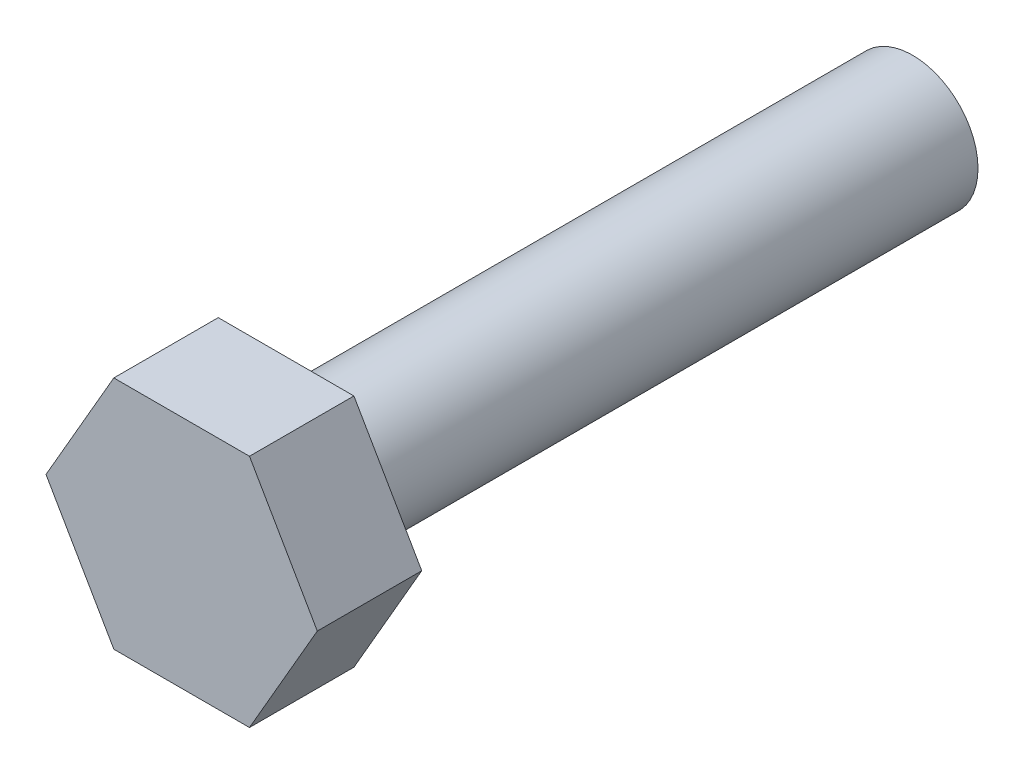
ISO-10303-21;
HEADER;
FILE_DESCRIPTION(('STEP AP214'),'2;1');
FILE_NAME('part.step','',(''),(''),'','','');
FILE_SCHEMA(('AUTOMOTIVE_DESIGN { 1 0 10303 214 1 1 1 1 }'));
ENDSEC;
DATA;
#1=APPLICATION_CONTEXT('core data for automotive mechanical design processes');
#2=APPLICATION_PROTOCOL_DEFINITION('international standard','automotive_design',2000,#1);
#3=PRODUCT_CONTEXT('',#1,'mechanical');
#4=PRODUCT('Part','Part','',(#3));
#5=PRODUCT_RELATED_PRODUCT_CATEGORY('part','',(#4));
#6=PRODUCT_DEFINITION_FORMATION('','',#4);
#7=PRODUCT_DEFINITION_CONTEXT('part definition',#1,'design');
#8=PRODUCT_DEFINITION('design','',#6,#7);
#9=PRODUCT_DEFINITION_SHAPE('','',#8);
#10=(LENGTH_UNIT() NAMED_UNIT(*) SI_UNIT(.MILLI.,.METRE.));
#11=(NAMED_UNIT(*) PLANE_ANGLE_UNIT() SI_UNIT($,.RADIAN.));
#12=(NAMED_UNIT(*) SI_UNIT($,.STERADIAN.) SOLID_ANGLE_UNIT());
#13=UNCERTAINTY_MEASURE_WITH_UNIT(LENGTH_MEASURE(1.E-05),#10,'distance_accuracy_value','');
#14=(GEOMETRIC_REPRESENTATION_CONTEXT(3) GLOBAL_UNCERTAINTY_ASSIGNED_CONTEXT((#13)) GLOBAL_UNIT_ASSIGNED_CONTEXT((#10,
#11,#12)) REPRESENTATION_CONTEXT('',''));
#15=CARTESIAN_POINT('',(0.,0.,0.));
#16=DIRECTION('',(0.,0.,1.));
#17=DIRECTION('',(1.,0.,0.));
#18=AXIS2_PLACEMENT_3D('',#15,#16,#17);
#19=CARTESIAN_POINT('',(0.,0.,-38.1));
#20=DIRECTION('',(0.,0.,1.));
#21=DIRECTION('',(1.,0.,0.));
#22=AXIS2_PLACEMENT_3D('',#19,#20,#21);
#23=CYLINDRICAL_SURFACE('',#22,3.9751);
#24=CARTESIAN_POINT('',(0.,0.,-38.1));
#25=DIRECTION('',(0.,0.,1.));
#26=DIRECTION('',(1.,0.,0.));
#27=AXIS2_PLACEMENT_3D('',#24,#25,#26);
#28=CIRCLE('',#27,3.9751);
#29=CARTESIAN_POINT('',(3.9751,0.,-38.1));
#30=VERTEX_POINT('',#29);
#31=EDGE_CURVE('E11',#30,#30,#28,.T.);
#32=CARTESIAN_POINT('',(0.,0.,0.));
#33=DIRECTION('',(0.,0.,1.));
#34=DIRECTION('',(1.,0.,0.));
#35=AXIS2_PLACEMENT_3D('',#32,#33,#34);
#36=CIRCLE('',#35,3.9751);
#37=CARTESIAN_POINT('',(3.9751,0.,0.));
#38=VERTEX_POINT('',#37);
#39=EDGE_CURVE('E35',#38,#38,#36,.T.);
#40=CARTESIAN_POINT('',(3.9751,0.,-38.1));
#41=CARTESIAN_POINT('',(3.9751,0.,-37.703125));
#42=CARTESIAN_POINT('',(3.9751,0.,-37.30625));
#43=CARTESIAN_POINT('',(3.9751,0.,-36.5125));
#44=CARTESIAN_POINT('',(3.9751,0.,-36.115625));
#45=CARTESIAN_POINT('',(3.9751,0.,-35.321875));
#46=CARTESIAN_POINT('',(3.9751,0.,-34.925));
#47=CARTESIAN_POINT('',(3.9751,0.,-34.13125));
#48=CARTESIAN_POINT('',(3.9751,0.,-33.734375));
#49=CARTESIAN_POINT('',(3.9751,0.,-32.940625));
#50=CARTESIAN_POINT('',(3.9751,0.,-32.54375));
#51=CARTESIAN_POINT('',(3.9751,0.,-31.75));
#52=CARTESIAN_POINT('',(3.9751,0.,-31.353125));
#53=CARTESIAN_POINT('',(3.9751,0.,-30.559375));
#54=CARTESIAN_POINT('',(3.9751,0.,-30.1625));
#55=CARTESIAN_POINT('',(3.9751,0.,-29.36875));
#56=CARTESIAN_POINT('',(3.9751,0.,-28.971875));
#57=CARTESIAN_POINT('',(3.9751,0.,-28.178125));
#58=CARTESIAN_POINT('',(3.9751,0.,-27.78125));
#59=CARTESIAN_POINT('',(3.9751,0.,-26.9875));
#60=CARTESIAN_POINT('',(3.9751,0.,-26.590625));
#61=CARTESIAN_POINT('',(3.9751,0.,-25.796875));
#62=CARTESIAN_POINT('',(3.9751,0.,-25.4));
#63=CARTESIAN_POINT('',(3.9751,0.,-24.60625));
#64=CARTESIAN_POINT('',(3.9751,0.,-24.209375));
#65=CARTESIAN_POINT('',(3.9751,0.,-23.415625));
#66=CARTESIAN_POINT('',(3.9751,0.,-23.01875));
#67=CARTESIAN_POINT('',(3.9751,0.,-22.225));
#68=CARTESIAN_POINT('',(3.9751,0.,-21.828125));
#69=CARTESIAN_POINT('',(3.9751,0.,-21.034375));
#70=CARTESIAN_POINT('',(3.9751,0.,-20.6375));
#71=CARTESIAN_POINT('',(3.9751,0.,-19.84375));
#72=CARTESIAN_POINT('',(3.9751,0.,-19.446875));
#73=CARTESIAN_POINT('',(3.9751,0.,-18.653125));
#74=CARTESIAN_POINT('',(3.9751,0.,-18.25625));
#75=CARTESIAN_POINT('',(3.9751,0.,-17.4625));
#76=CARTESIAN_POINT('',(3.9751,0.,-17.065625));
#77=CARTESIAN_POINT('',(3.9751,0.,-16.271875));
#78=CARTESIAN_POINT('',(3.9751,0.,-15.875));
#79=CARTESIAN_POINT('',(3.9751,0.,-15.08125));
#80=CARTESIAN_POINT('',(3.9751,0.,-14.684375));
#81=CARTESIAN_POINT('',(3.9751,0.,-13.890625));
#82=CARTESIAN_POINT('',(3.9751,0.,-13.49375));
#83=CARTESIAN_POINT('',(3.9751,0.,-12.7));
#84=CARTESIAN_POINT('',(3.9751,0.,-12.303125));
#85=CARTESIAN_POINT('',(3.9751,0.,-11.509375));
#86=CARTESIAN_POINT('',(3.9751,0.,-11.1125));
#87=CARTESIAN_POINT('',(3.9751,0.,-10.31875));
#88=CARTESIAN_POINT('',(3.9751,0.,-9.921875));
#89=CARTESIAN_POINT('',(3.9751,0.,-9.128125));
#90=CARTESIAN_POINT('',(3.9751,0.,-8.73125));
#91=CARTESIAN_POINT('',(3.9751,0.,-7.9375));
#92=CARTESIAN_POINT('',(3.9751,0.,-7.540625));
#93=CARTESIAN_POINT('',(3.9751,0.,-6.746875));
#94=CARTESIAN_POINT('',(3.9751,0.,-6.35));
#95=CARTESIAN_POINT('',(3.9751,0.,-5.55625));
#96=CARTESIAN_POINT('',(3.9751,0.,-5.159375));
#97=CARTESIAN_POINT('',(3.9751,0.,-4.365625));
#98=CARTESIAN_POINT('',(3.9751,0.,-3.96875));
#99=CARTESIAN_POINT('',(3.9751,0.,-3.175));
#100=CARTESIAN_POINT('',(3.9751,0.,-2.778125));
#101=CARTESIAN_POINT('',(3.9751,0.,-1.984375));
#102=CARTESIAN_POINT('',(3.9751,0.,-1.5875));
#103=CARTESIAN_POINT('',(3.9751,0.,-0.79375));
#104=CARTESIAN_POINT('',(3.9751,0.,-0.396875));
#105=CARTESIAN_POINT('',(3.9751,0.,0.));
#106=B_SPLINE_CURVE_WITH_KNOTS('',3,(#40,#41,#42,#43,#44,#45,#46,#47,#48,#49,#50,#51,#52,#53,
#54,#55,#56,#57,#58,#59,#60,#61,#62,#63,#64,#65,#66,#67,#68,#69,#70,#71,#72,#73,#74,#75,#76,#77,
#78,#79,#80,#81,#82,#83,#84,#85,#86,#87,#88,#89,#90,#91,#92,#93,#94,#95,#96,#97,#98,#99,#100,
#101,#102,#103,#104,#105),.UNSPECIFIED.,.F.,.F.,(4,2,2,2,2,2,2,2,2,2,2,2,2,2,2,2,2,2,2,2,2,2,2,
2,2,2,2,2,2,2,2,2,4),(0.,1.19062499999999,2.38124999999999,3.571875,4.7625,5.953125,7.14375,
8.334375,9.525,10.715625,11.90625,13.096875,14.2875,15.478125,16.66875,17.859375,19.05,
20.240625,21.43125,22.621875,23.8125,25.003125,26.19375,27.384375,28.575,29.765625,30.95625,
32.146875,33.3375,34.528125,35.71875,36.909375,38.1),.UNSPECIFIED.);
#107=EDGE_CURVE('BSEAM32',#30,#38,#106,.T.);
#108=ORIENTED_EDGE('',*,*,#31,.T.);
#109=ORIENTED_EDGE('',*,*,#39,.F.);
#110=ORIENTED_EDGE('',*,*,#107,.T.);
#111=ORIENTED_EDGE('',*,*,#107,.F.);
#112=EDGE_LOOP('',(#108,#110,#109,#111));
#113=FACE_BOUND('',#112,.T.);
#114=ADVANCED_FACE('F32',(#113),#23,.T.);
#115=CARTESIAN_POINT('',(0.,0.,-38.1));
#116=DIRECTION('',(0.,0.,1.));
#117=DIRECTION('',(1.,0.,0.));
#118=AXIS2_PLACEMENT_3D('',#115,#116,#117);
#119=PLANE('',#118);
#120=ORIENTED_EDGE('',*,*,#31,.F.);
#121=EDGE_LOOP('',(#120));
#122=FACE_BOUND('',#121,.T.);
#123=ADVANCED_FACE('F143',(#122),#119,.F.);
#124=CARTESIAN_POINT('',(4.12444598552339,-7.14375,6.35));
#125=DIRECTION('',(-0.866025403784439,0.5,0.));
#126=DIRECTION('',(-0.5,-0.866025403784439,0.));
#127=AXIS2_PLACEMENT_3D('',#124,#125,#126);
#128=PLANE('',#127);
#129=DIRECTION('',(0.5,0.866025403784439,0.));
#130=VECTOR('',#129,1.);
#131=CARTESIAN_POINT('',(4.12444598552339,-7.14375,0.));
#132=LINE('',#131,#130);
#133=CARTESIAN_POINT('',(4.12444598552339,-7.14375,0.));
#134=VERTEX_POINT('',#133);
#135=CARTESIAN_POINT('',(8.24889197104678,0.,0.));
#136=VERTEX_POINT('',#135);
#137=EDGE_CURVE('E117',#134,#136,#132,.T.);
#138=ORIENTED_EDGE('',*,*,#137,.T.);
#139=DIRECTION('',(0.,0.,-1.));
#140=VECTOR('',#139,1.);
#141=CARTESIAN_POINT('',(8.24889197104678,0.,6.35));
#142=LINE('',#141,#140);
#143=CARTESIAN_POINT('',(8.24889197104678,0.,6.35));
#144=VERTEX_POINT('',#143);
#145=EDGE_CURVE('E134',#144,#136,#142,.T.);
#146=ORIENTED_EDGE('',*,*,#145,.F.);
#147=DIRECTION('',(0.5,0.866025403784439,0.));
#148=VECTOR('',#147,1.);
#149=CARTESIAN_POINT('',(4.12444598552339,-7.14375,6.35));
#150=LINE('',#149,#148);
#151=CARTESIAN_POINT('',(4.12444598552339,-7.14375,6.35));
#152=VERTEX_POINT('',#151);
#153=EDGE_CURVE('E127',#152,#144,#150,.T.);
#154=ORIENTED_EDGE('',*,*,#153,.F.);
#155=DIRECTION('',(0.,0.,-1.));
#156=VECTOR('',#155,1.);
#157=CARTESIAN_POINT('',(4.12444598552339,-7.14375,6.35));
#158=LINE('',#157,#156);
#159=EDGE_CURVE('E113',#152,#134,#158,.T.);
#160=ORIENTED_EDGE('',*,*,#159,.T.);
#161=EDGE_LOOP('',(#138,#146,#154,#160));
#162=FACE_BOUND('',#161,.T.);
#163=ADVANCED_FACE('F148',(#162),#128,.F.);
#164=CARTESIAN_POINT('',(8.24889197104678,0.,6.35));
#165=DIRECTION('',(-0.866025403784439,-0.5,0.));
#166=DIRECTION('',(0.5,-0.866025403784439,0.));
#167=AXIS2_PLACEMENT_3D('',#164,#165,#166);
#168=PLANE('',#167);
#169=DIRECTION('',(-0.5,0.866025403784439,0.));
#170=VECTOR('',#169,1.);
#171=CARTESIAN_POINT('',(8.24889197104678,0.,0.));
#172=LINE('',#171,#170);
#173=CARTESIAN_POINT('',(4.12444598552339,7.14375,0.));
#174=VERTEX_POINT('',#173);
#175=EDGE_CURVE('E120',#136,#174,#172,.T.);
#176=ORIENTED_EDGE('',*,*,#175,.T.);
#177=DIRECTION('',(0.,0.,-1.));
#178=VECTOR('',#177,1.);
#179=CARTESIAN_POINT('',(4.12444598552339,7.14375,6.35));
#180=LINE('',#179,#178);
#181=CARTESIAN_POINT('',(4.12444598552339,7.14375,6.35));
#182=VERTEX_POINT('',#181);
#183=EDGE_CURVE('E131',#182,#174,#180,.T.);
#184=ORIENTED_EDGE('',*,*,#183,.F.);
#185=DIRECTION('',(-0.5,0.866025403784439,0.));
#186=VECTOR('',#185,1.);
#187=CARTESIAN_POINT('',(8.24889197104678,0.,6.35));
#188=LINE('',#187,#186);
#189=EDGE_CURVE('E86',#144,#182,#188,.T.);
#190=ORIENTED_EDGE('',*,*,#189,.F.);
#191=ORIENTED_EDGE('',*,*,#145,.T.);
#192=EDGE_LOOP('',(#176,#184,#190,#191));
#193=FACE_BOUND('',#192,.T.);
#194=ADVANCED_FACE('F154',(#193),#168,.F.);
#195=CARTESIAN_POINT('',(4.12444598552339,7.14375,6.35));
#196=DIRECTION('',(0.,-1.,0.));
#197=DIRECTION('',(0.,0.,-1.));
#198=AXIS2_PLACEMENT_3D('',#195,#196,#197);
#199=PLANE('',#198);
#200=DIRECTION('',(-1.,0.,0.));
#201=VECTOR('',#200,1.);
#202=CARTESIAN_POINT('',(4.12444598552339,7.14375,0.));
#203=LINE('',#202,#201);
#204=CARTESIAN_POINT('',(-4.12444598552339,7.14375,0.));
#205=VERTEX_POINT('',#204);
#206=EDGE_CURVE('E122',#174,#205,#203,.T.);
#207=ORIENTED_EDGE('',*,*,#206,.T.);
#208=DIRECTION('',(0.,0.,-1.));
#209=VECTOR('',#208,1.);
#210=CARTESIAN_POINT('',(-4.12444598552339,7.14375,6.35));
#211=LINE('',#210,#209);
#212=CARTESIAN_POINT('',(-4.12444598552339,7.14375,6.35));
#213=VERTEX_POINT('',#212);
#214=EDGE_CURVE('E108',#213,#205,#211,.T.);
#215=ORIENTED_EDGE('',*,*,#214,.F.);
#216=DIRECTION('',(-1.,0.,0.));
#217=VECTOR('',#216,1.);
#218=CARTESIAN_POINT('',(4.12444598552339,7.14375,6.35));
#219=LINE('',#218,#217);
#220=EDGE_CURVE('E99',#182,#213,#219,.T.);
#221=ORIENTED_EDGE('',*,*,#220,.F.);
#222=ORIENTED_EDGE('',*,*,#183,.T.);
#223=EDGE_LOOP('',(#207,#215,#221,#222));
#224=FACE_BOUND('',#223,.T.);
#225=ADVANCED_FACE('F160',(#224),#199,.F.);
#226=CARTESIAN_POINT('',(-4.12444598552339,7.14375,6.35));
#227=DIRECTION('',(0.866025403784439,-0.5,0.));
#228=DIRECTION('',(0.5,0.866025403784439,0.));
#229=AXIS2_PLACEMENT_3D('',#226,#227,#228);
#230=PLANE('',#229);
#231=DIRECTION('',(-0.5,-0.866025403784439,0.));
#232=VECTOR('',#231,1.);
#233=CARTESIAN_POINT('',(-4.12444598552339,7.14375,0.));
#234=LINE('',#233,#232);
#235=CARTESIAN_POINT('',(-8.24889197104678,0.,0.));
#236=VERTEX_POINT('',#235);
#237=EDGE_CURVE('E107',#205,#236,#234,.T.);
#238=ORIENTED_EDGE('',*,*,#237,.T.);
#239=DIRECTION('',(0.,0.,-1.));
#240=VECTOR('',#239,1.);
#241=CARTESIAN_POINT('',(-8.24889197104678,0.,6.35));
#242=LINE('',#241,#240);
#243=CARTESIAN_POINT('',(-8.24889197104678,0.,6.35));
#244=VERTEX_POINT('',#243);
#245=EDGE_CURVE('E104',#244,#236,#242,.T.);
#246=ORIENTED_EDGE('',*,*,#245,.F.);
#247=DIRECTION('',(-0.5,-0.866025403784439,0.));
#248=VECTOR('',#247,1.);
#249=CARTESIAN_POINT('',(-4.12444598552339,7.14375,6.35));
#250=LINE('',#249,#248);
#251=EDGE_CURVE('E93',#213,#244,#250,.T.);
#252=ORIENTED_EDGE('',*,*,#251,.F.);
#253=ORIENTED_EDGE('',*,*,#214,.T.);
#254=EDGE_LOOP('',(#238,#246,#252,#253));
#255=FACE_BOUND('',#254,.T.);
#256=ADVANCED_FACE('F105',(#255),#230,.F.);
#257=CARTESIAN_POINT('',(-8.24889197104678,0.,6.35));
#258=DIRECTION('',(0.866025403784439,0.5,0.));
#259=DIRECTION('',(-0.5,0.866025403784439,0.));
#260=AXIS2_PLACEMENT_3D('',#257,#258,#259);
#261=PLANE('',#260);
#262=DIRECTION('',(0.5,-0.866025403784439,0.));
#263=VECTOR('',#262,1.);
#264=CARTESIAN_POINT('',(-8.24889197104678,0.,0.));
#265=LINE('',#264,#263);
#266=CARTESIAN_POINT('',(-4.12444598552339,-7.14375,0.));
#267=VERTEX_POINT('',#266);
#268=EDGE_CURVE('E71',#236,#267,#265,.T.);
#269=ORIENTED_EDGE('',*,*,#268,.T.);
#270=DIRECTION('',(0.,0.,-1.));
#271=VECTOR('',#270,1.);
#272=CARTESIAN_POINT('',(-4.12444598552339,-7.14375,6.35));
#273=LINE('',#272,#271);
#274=CARTESIAN_POINT('',(-4.12444598552339,-7.14375,6.35));
#275=VERTEX_POINT('',#274);
#276=EDGE_CURVE('E109',#275,#267,#273,.T.);
#277=ORIENTED_EDGE('',*,*,#276,.F.);
#278=DIRECTION('',(0.5,-0.866025403784439,0.));
#279=VECTOR('',#278,1.);
#280=CARTESIAN_POINT('',(-8.24889197104678,0.,6.35));
#281=LINE('',#280,#279);
#282=EDGE_CURVE('E97',#244,#275,#281,.T.);
#283=ORIENTED_EDGE('',*,*,#282,.F.);
#284=ORIENTED_EDGE('',*,*,#245,.T.);
#285=EDGE_LOOP('',(#269,#277,#283,#284));
#286=FACE_BOUND('',#285,.T.);
#287=ADVANCED_FACE('F111',(#286),#261,.F.);
#288=CARTESIAN_POINT('',(-4.12444598552339,-7.14375,6.35));
#289=DIRECTION('',(0.,1.,0.));
#290=DIRECTION('',(-1.,0.,0.));
#291=AXIS2_PLACEMENT_3D('',#288,#289,#290);
#292=PLANE('',#291);
#293=DIRECTION('',(1.,0.,0.));
#294=VECTOR('',#293,1.);
#295=CARTESIAN_POINT('',(-4.12444598552339,-7.14375,0.));
#296=LINE('',#295,#294);
#297=EDGE_CURVE('E77',#267,#134,#296,.T.);
#298=ORIENTED_EDGE('',*,*,#297,.T.);
#299=ORIENTED_EDGE('',*,*,#159,.F.);
#300=DIRECTION('',(1.,0.,0.));
#301=VECTOR('',#300,1.);
#302=CARTESIAN_POINT('',(-4.12444598552339,-7.14375,6.35));
#303=LINE('',#302,#301);
#304=EDGE_CURVE('E48',#275,#152,#303,.T.);
#305=ORIENTED_EDGE('',*,*,#304,.F.);
#306=ORIENTED_EDGE('',*,*,#276,.T.);
#307=EDGE_LOOP('',(#298,#299,#305,#306));
#308=FACE_BOUND('',#307,.T.);
#309=ADVANCED_FACE('F168',(#308),#292,.F.);
#310=CARTESIAN_POINT('',(8.24889197104678,0.,6.35));
#311=DIRECTION('',(0.,0.,1.));
#312=DIRECTION('',(1.,0.,0.));
#313=AXIS2_PLACEMENT_3D('',#310,#311,#312);
#314=PLANE('',#313);
#315=ORIENTED_EDGE('',*,*,#153,.T.);
#316=ORIENTED_EDGE('',*,*,#189,.T.);
#317=ORIENTED_EDGE('',*,*,#220,.T.);
#318=ORIENTED_EDGE('',*,*,#251,.T.);
#319=ORIENTED_EDGE('',*,*,#282,.T.);
#320=ORIENTED_EDGE('',*,*,#304,.T.);
#321=EDGE_LOOP('',(#315,#316,#317,#318,#319,#320));
#322=FACE_BOUND('',#321,.T.);
#323=ADVANCED_FACE('F95',(#322),#314,.T.);
#324=CARTESIAN_POINT('',(8.24889197104678,0.,0.));
#325=DIRECTION('',(0.,0.,1.));
#326=DIRECTION('',(1.,0.,0.));
#327=AXIS2_PLACEMENT_3D('',#324,#325,#326);
#328=PLANE('',#327);
#329=ORIENTED_EDGE('',*,*,#39,.T.);
#330=EDGE_LOOP('',(#329));
#331=FACE_BOUND('',#330,.T.);
#332=ORIENTED_EDGE('',*,*,#137,.F.);
#333=ORIENTED_EDGE('',*,*,#297,.F.);
#334=ORIENTED_EDGE('',*,*,#268,.F.);
#335=ORIENTED_EDGE('',*,*,#237,.F.);
#336=ORIENTED_EDGE('',*,*,#206,.F.);
#337=ORIENTED_EDGE('',*,*,#175,.F.);
#338=EDGE_LOOP('',(#332,#333,#334,#335,#336,#337));
#339=FACE_BOUND('',#338,.T.);
#340=ADVANCED_FACE('F139',(#331,#339),#328,.F.);
#341=CLOSED_SHELL('',(#114,#123,#163,#194,#225,#256,#287,#309,#323,#340));
#342=MANIFOLD_SOLID_BREP('B2',#341);
#343=ADVANCED_BREP_SHAPE_REPRESENTATION('',(#18,#342),#14);
#344=SHAPE_DEFINITION_REPRESENTATION(#9,#343);
ENDSEC;
END-ISO-10303-21;
